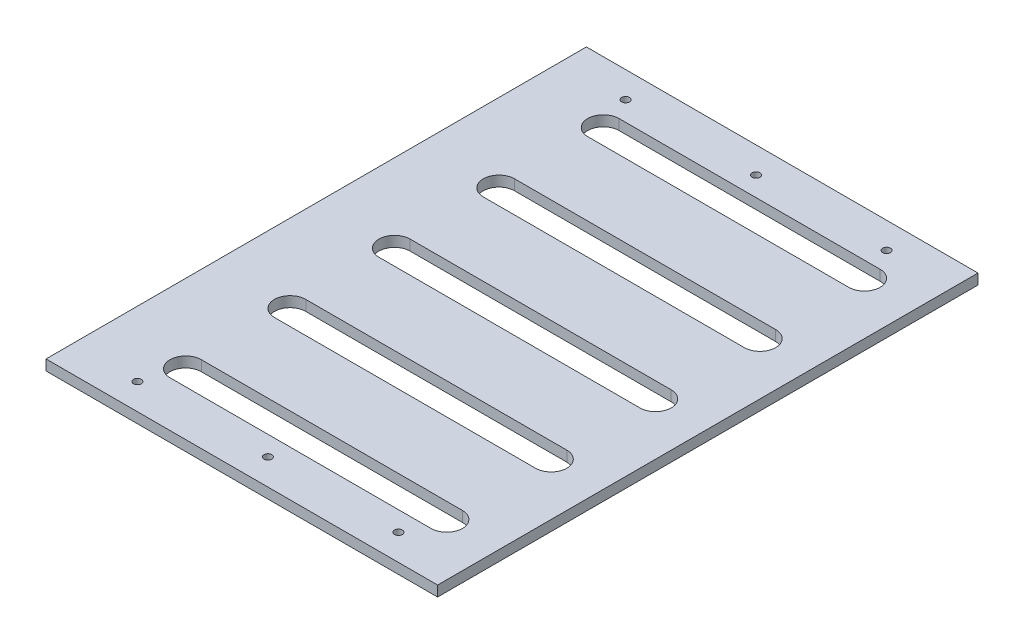
ISO-10303-21;
HEADER;
FILE_DESCRIPTION(('STEP AP214'),'2;1');
FILE_NAME('part.step','',(''),(''),'','','');
FILE_SCHEMA(('AUTOMOTIVE_DESIGN { 1 0 10303 214 1 1 1 1 }'));
ENDSEC;
DATA;
#1=APPLICATION_CONTEXT('core data for automotive mechanical design processes');
#2=APPLICATION_PROTOCOL_DEFINITION('international standard','automotive_design',2000,#1);
#3=PRODUCT_CONTEXT('',#1,'mechanical');
#4=PRODUCT('Part','Part','',(#3));
#5=PRODUCT_RELATED_PRODUCT_CATEGORY('part','',(#4));
#6=PRODUCT_DEFINITION_FORMATION('','',#4);
#7=PRODUCT_DEFINITION_CONTEXT('part definition',#1,'design');
#8=PRODUCT_DEFINITION('design','',#6,#7);
#9=PRODUCT_DEFINITION_SHAPE('','',#8);
#10=(LENGTH_UNIT() NAMED_UNIT(*) SI_UNIT(.MILLI.,.METRE.));
#11=(NAMED_UNIT(*) PLANE_ANGLE_UNIT() SI_UNIT($,.RADIAN.));
#12=(NAMED_UNIT(*) SI_UNIT($,.STERADIAN.) SOLID_ANGLE_UNIT());
#13=UNCERTAINTY_MEASURE_WITH_UNIT(LENGTH_MEASURE(1.E-05),#10,'distance_accuracy_value','');
#14=(GEOMETRIC_REPRESENTATION_CONTEXT(3) GLOBAL_UNCERTAINTY_ASSIGNED_CONTEXT((#13)) GLOBAL_UNIT_ASSIGNED_CONTEXT((#10,
#11,#12)) REPRESENTATION_CONTEXT('',''));
#15=CARTESIAN_POINT('',(0.,0.,0.));
#16=DIRECTION('',(0.,0.,1.));
#17=DIRECTION('',(1.,0.,0.));
#18=AXIS2_PLACEMENT_3D('',#15,#16,#17);
#19=CARTESIAN_POINT('',(0.,4.,0.));
#20=DIRECTION('',(1.,0.,0.));
#21=DIRECTION('',(0.,0.,-1.));
#22=AXIS2_PLACEMENT_3D('',#19,#20,#21);
#23=PLANE('',#22);
#24=DIRECTION('',(0.,0.,1.));
#25=VECTOR('',#24,1.);
#26=CARTESIAN_POINT('',(0.,0.,0.));
#27=LINE('',#26,#25);
#28=CARTESIAN_POINT('',(0.,0.,-207.));
#29=VERTEX_POINT('',#28);
#30=CARTESIAN_POINT('',(0.,0.,0.));
#31=VERTEX_POINT('',#30);
#32=EDGE_CURVE('E356',#29,#31,#27,.T.);
#33=ORIENTED_EDGE('',*,*,#32,.T.);
#34=DIRECTION('',(0.,-1.,0.));
#35=VECTOR('',#34,1.);
#36=CARTESIAN_POINT('',(0.,4.,0.));
#37=LINE('',#36,#35);
#38=CARTESIAN_POINT('',(0.,4.,0.));
#39=VERTEX_POINT('',#38);
#40=EDGE_CURVE('E11',#39,#31,#37,.T.);
#41=ORIENTED_EDGE('',*,*,#40,.F.);
#42=DIRECTION('',(0.,0.,1.));
#43=VECTOR('',#42,1.);
#44=CARTESIAN_POINT('',(0.,4.,0.));
#45=LINE('',#44,#43);
#46=CARTESIAN_POINT('',(0.,4.,-207.));
#47=VERTEX_POINT('',#46);
#48=EDGE_CURVE('E363',#47,#39,#45,.T.);
#49=ORIENTED_EDGE('',*,*,#48,.F.);
#50=DIRECTION('',(0.,-1.,0.));
#51=VECTOR('',#50,1.);
#52=CARTESIAN_POINT('',(0.,4.,-207.));
#53=LINE('',#52,#51);
#54=EDGE_CURVE('E373',#47,#29,#53,.T.);
#55=ORIENTED_EDGE('',*,*,#54,.T.);
#56=EDGE_LOOP('',(#33,#41,#49,#55));
#57=FACE_BOUND('',#56,.T.);
#58=ADVANCED_FACE('F33',(#57),#23,.F.);
#59=CARTESIAN_POINT('',(0.,4.,0.));
#60=DIRECTION('',(0.,0.,-1.));
#61=DIRECTION('',(-1.,0.,0.));
#62=AXIS2_PLACEMENT_3D('',#59,#60,#61);
#63=PLANE('',#62);
#64=DIRECTION('',(1.,0.,0.));
#65=VECTOR('',#64,1.);
#66=CARTESIAN_POINT('',(0.,0.,0.));
#67=LINE('',#66,#65);
#68=CARTESIAN_POINT('',(150.,0.,0.));
#69=VERTEX_POINT('',#68);
#70=EDGE_CURVE('E376',#31,#69,#67,.T.);
#71=ORIENTED_EDGE('',*,*,#70,.T.);
#72=DIRECTION('',(0.,-1.,0.));
#73=VECTOR('',#72,1.);
#74=CARTESIAN_POINT('',(150.,4.,0.));
#75=LINE('',#74,#73);
#76=CARTESIAN_POINT('',(150.,4.,0.));
#77=VERTEX_POINT('',#76);
#78=EDGE_CURVE('E40',#77,#69,#75,.T.);
#79=ORIENTED_EDGE('',*,*,#78,.F.);
#80=DIRECTION('',(1.,0.,0.));
#81=VECTOR('',#80,1.);
#82=CARTESIAN_POINT('',(0.,4.,0.));
#83=LINE('',#82,#81);
#84=EDGE_CURVE('E366',#39,#77,#83,.T.);
#85=ORIENTED_EDGE('',*,*,#84,.F.);
#86=ORIENTED_EDGE('',*,*,#40,.T.);
#87=EDGE_LOOP('',(#71,#79,#85,#86));
#88=FACE_BOUND('',#87,.T.);
#89=ADVANCED_FACE('F405',(#88),#63,.F.);
#90=CARTESIAN_POINT('',(150.,4.,0.));
#91=DIRECTION('',(-1.,0.,0.));
#92=DIRECTION('',(0.,0.,1.));
#93=AXIS2_PLACEMENT_3D('',#90,#91,#92);
#94=PLANE('',#93);
#95=DIRECTION('',(0.,0.,-1.));
#96=VECTOR('',#95,1.);
#97=CARTESIAN_POINT('',(150.,0.,0.));
#98=LINE('',#97,#96);
#99=CARTESIAN_POINT('',(150.,0.,-207.));
#100=VERTEX_POINT('',#99);
#101=EDGE_CURVE('E378',#69,#100,#98,.T.);
#102=ORIENTED_EDGE('',*,*,#101,.T.);
#103=DIRECTION('',(0.,-1.,0.));
#104=VECTOR('',#103,1.);
#105=CARTESIAN_POINT('',(150.,4.,-207.));
#106=LINE('',#105,#104);
#107=CARTESIAN_POINT('',(150.,4.,-207.));
#108=VERTEX_POINT('',#107);
#109=EDGE_CURVE('E383',#108,#100,#106,.T.);
#110=ORIENTED_EDGE('',*,*,#109,.F.);
#111=DIRECTION('',(0.,0.,-1.));
#112=VECTOR('',#111,1.);
#113=CARTESIAN_POINT('',(150.,4.,0.));
#114=LINE('',#113,#112);
#115=EDGE_CURVE('E369',#77,#108,#114,.T.);
#116=ORIENTED_EDGE('',*,*,#115,.F.);
#117=ORIENTED_EDGE('',*,*,#78,.T.);
#118=EDGE_LOOP('',(#102,#110,#116,#117));
#119=FACE_BOUND('',#118,.T.);
#120=ADVANCED_FACE('F390',(#119),#94,.F.);
#121=CARTESIAN_POINT('',(0.,4.,-207.));
#122=DIRECTION('',(0.,0.,1.));
#123=DIRECTION('',(1.,0.,0.));
#124=AXIS2_PLACEMENT_3D('',#121,#122,#123);
#125=PLANE('',#124);
#126=DIRECTION('',(-1.,0.,0.));
#127=VECTOR('',#126,1.);
#128=CARTESIAN_POINT('',(0.,0.,-207.));
#129=LINE('',#128,#127);
#130=EDGE_CURVE('E367',#100,#29,#129,.T.);
#131=ORIENTED_EDGE('',*,*,#130,.T.);
#132=ORIENTED_EDGE('',*,*,#54,.F.);
#133=DIRECTION('',(-1.,0.,0.));
#134=VECTOR('',#133,1.);
#135=CARTESIAN_POINT('',(0.,4.,-207.));
#136=LINE('',#135,#134);
#137=EDGE_CURVE('E371',#108,#47,#136,.T.);
#138=ORIENTED_EDGE('',*,*,#137,.F.);
#139=ORIENTED_EDGE('',*,*,#109,.T.);
#140=EDGE_LOOP('',(#131,#132,#138,#139));
#141=FACE_BOUND('',#140,.T.);
#142=ADVANCED_FACE('F398',(#141),#125,.F.);
#143=CARTESIAN_POINT('',(0.,4.,0.));
#144=DIRECTION('',(0.,-1.,0.));
#145=DIRECTION('',(0.,0.,-1.));
#146=AXIS2_PLACEMENT_3D('',#143,#144,#145);
#147=PLANE('',#146);
#148=CARTESIAN_POINT('',(75.,4.,-197.));
#149=DIRECTION('',(0.,1.,0.));
#150=DIRECTION('',(0.,0.,1.));
#151=AXIS2_PLACEMENT_3D('',#148,#149,#150);
#152=CIRCLE('',#151,1.50000000000001);
#153=CARTESIAN_POINT('',(75.,4.,-195.5));
#154=VERTEX_POINT('',#153);
#155=EDGE_CURVE('E527',#154,#154,#152,.T.);
#156=ORIENTED_EDGE('',*,*,#155,.F.);
#157=EDGE_LOOP('',(#156));
#158=FACE_BOUND('',#157,.T.);
#159=CARTESIAN_POINT('',(25.,4.,-197.));
#160=DIRECTION('',(0.,1.,0.));
#161=DIRECTION('',(0.,0.,1.));
#162=AXIS2_PLACEMENT_3D('',#159,#160,#161);
#163=CIRCLE('',#162,1.5);
#164=CARTESIAN_POINT('',(25.,4.,-195.5));
#165=VERTEX_POINT('',#164);
#166=EDGE_CURVE('E532',#165,#165,#163,.T.);
#167=ORIENTED_EDGE('',*,*,#166,.F.);
#168=EDGE_LOOP('',(#167));
#169=FACE_BOUND('',#168,.T.);
#170=CARTESIAN_POINT('',(25.,4.,-10.));
#171=DIRECTION('',(0.,1.,0.));
#172=DIRECTION('',(0.,0.,-1.));
#173=AXIS2_PLACEMENT_3D('',#170,#171,#172);
#174=CIRCLE('',#173,1.5);
#175=CARTESIAN_POINT('',(25.,4.,-11.5));
#176=VERTEX_POINT('',#175);
#177=EDGE_CURVE('E540',#176,#176,#174,.T.);
#178=ORIENTED_EDGE('',*,*,#177,.F.);
#179=EDGE_LOOP('',(#178));
#180=FACE_BOUND('',#179,.T.);
#181=CARTESIAN_POINT('',(75.,4.,-9.99999999999995));
#182=DIRECTION('',(0.,1.,0.));
#183=DIRECTION('',(0.,0.,-1.));
#184=AXIS2_PLACEMENT_3D('',#181,#182,#183);
#185=CIRCLE('',#184,1.50000000000001);
#186=CARTESIAN_POINT('',(75.,4.,-11.5));
#187=VERTEX_POINT('',#186);
#188=EDGE_CURVE('E546',#187,#187,#185,.T.);
#189=ORIENTED_EDGE('',*,*,#188,.F.);
#190=EDGE_LOOP('',(#189));
#191=FACE_BOUND('',#190,.T.);
#192=CARTESIAN_POINT('',(125.,4.,-10.));
#193=DIRECTION('',(0.,1.,0.));
#194=DIRECTION('',(0.,0.,-1.));
#195=AXIS2_PLACEMENT_3D('',#192,#193,#194);
#196=CIRCLE('',#195,1.5);
#197=CARTESIAN_POINT('',(125.,4.,-11.5));
#198=VERTEX_POINT('',#197);
#199=EDGE_CURVE('E552',#198,#198,#196,.T.);
#200=ORIENTED_EDGE('',*,*,#199,.F.);
#201=EDGE_LOOP('',(#200));
#202=FACE_BOUND('',#201,.T.);
#203=CARTESIAN_POINT('',(125.,4.,-197.));
#204=DIRECTION('',(0.,1.,0.));
#205=DIRECTION('',(0.,0.,1.));
#206=AXIS2_PLACEMENT_3D('',#203,#204,#205);
#207=CIRCLE('',#206,1.5);
#208=CARTESIAN_POINT('',(125.,4.,-195.5));
#209=VERTEX_POINT('',#208);
#210=EDGE_CURVE('E220',#209,#209,#207,.T.);
#211=ORIENTED_EDGE('',*,*,#210,.F.);
#212=EDGE_LOOP('',(#211));
#213=FACE_BOUND('',#212,.T.);
#214=DIRECTION('',(1.,0.,0.));
#215=VECTOR('',#214,1.);
#216=CARTESIAN_POINT('',(30.,4.,-137.5));
#217=LINE('',#216,#215);
#218=CARTESIAN_POINT('',(30.,4.,-137.5));
#219=VERTEX_POINT('',#218);
#220=CARTESIAN_POINT('',(130.,4.,-137.5));
#221=VERTEX_POINT('',#220);
#222=EDGE_CURVE('E226',#219,#221,#217,.T.);
#223=ORIENTED_EDGE('',*,*,#222,.F.);
#224=CARTESIAN_POINT('',(30.,4.,-143.5));
#225=DIRECTION('',(0.,1.,0.));
#226=DIRECTION('',(0.,0.,1.));
#227=AXIS2_PLACEMENT_3D('',#224,#225,#226);
#228=CIRCLE('',#227,6.00000000000001);
#229=CARTESIAN_POINT('',(30.,4.,-149.5));
#230=VERTEX_POINT('',#229);
#231=EDGE_CURVE('E47',#230,#219,#228,.T.);
#232=ORIENTED_EDGE('',*,*,#231,.F.);
#233=DIRECTION('',(-1.,0.,0.));
#234=VECTOR('',#233,1.);
#235=CARTESIAN_POINT('',(30.,4.,-149.5));
#236=LINE('',#235,#234);
#237=CARTESIAN_POINT('',(130.,4.,-149.5));
#238=VERTEX_POINT('',#237);
#239=EDGE_CURVE('E214',#238,#230,#236,.T.);
#240=ORIENTED_EDGE('',*,*,#239,.F.);
#241=CARTESIAN_POINT('',(130.,4.,-143.5));
#242=DIRECTION('',(0.,1.,0.));
#243=DIRECTION('',(0.,0.,1.));
#244=AXIS2_PLACEMENT_3D('',#241,#242,#243);
#245=CIRCLE('',#244,6.00000000000001);
#246=EDGE_CURVE('E217',#221,#238,#245,.T.);
#247=ORIENTED_EDGE('',*,*,#246,.F.);
#248=EDGE_LOOP('',(#223,#232,#240,#247));
#249=FACE_BOUND('',#248,.T.);
#250=DIRECTION('',(1.,0.,0.));
#251=VECTOR('',#250,1.);
#252=CARTESIAN_POINT('',(30.,4.,-97.5));
#253=LINE('',#252,#251);
#254=CARTESIAN_POINT('',(30.,4.,-97.5));
#255=VERTEX_POINT('',#254);
#256=CARTESIAN_POINT('',(130.,4.,-97.5));
#257=VERTEX_POINT('',#256);
#258=EDGE_CURVE('E252',#255,#257,#253,.T.);
#259=ORIENTED_EDGE('',*,*,#258,.F.);
#260=CARTESIAN_POINT('',(30.,4.,-103.5));
#261=DIRECTION('',(0.,1.,0.));
#262=DIRECTION('',(0.,0.,-1.));
#263=AXIS2_PLACEMENT_3D('',#260,#261,#262);
#264=CIRCLE('',#263,6.00000000000001);
#265=CARTESIAN_POINT('',(30.,4.,-109.5));
#266=VERTEX_POINT('',#265);
#267=EDGE_CURVE('E55',#266,#255,#264,.T.);
#268=ORIENTED_EDGE('',*,*,#267,.F.);
#269=DIRECTION('',(-1.,0.,0.));
#270=VECTOR('',#269,1.);
#271=CARTESIAN_POINT('',(30.,4.,-109.5));
#272=LINE('',#271,#270);
#273=CARTESIAN_POINT('',(130.,4.,-109.5));
#274=VERTEX_POINT('',#273);
#275=EDGE_CURVE('E241',#274,#266,#272,.T.);
#276=ORIENTED_EDGE('',*,*,#275,.F.);
#277=CARTESIAN_POINT('',(130.,4.,-103.5));
#278=DIRECTION('',(0.,1.,0.));
#279=DIRECTION('',(0.,0.,-1.));
#280=AXIS2_PLACEMENT_3D('',#277,#278,#279);
#281=CIRCLE('',#280,6.00000000000001);
#282=EDGE_CURVE('E256',#257,#274,#281,.T.);
#283=ORIENTED_EDGE('',*,*,#282,.F.);
#284=EDGE_LOOP('',(#259,#268,#276,#283));
#285=FACE_BOUND('',#284,.T.);
#286=DIRECTION('',(1.,0.,0.));
#287=VECTOR('',#286,1.);
#288=CARTESIAN_POINT('',(30.,4.,-57.5));
#289=LINE('',#288,#287);
#290=CARTESIAN_POINT('',(30.,4.,-57.5));
#291=VERTEX_POINT('',#290);
#292=CARTESIAN_POINT('',(130.,4.,-57.5));
#293=VERTEX_POINT('',#292);
#294=EDGE_CURVE('E283',#291,#293,#289,.T.);
#295=ORIENTED_EDGE('',*,*,#294,.F.);
#296=CARTESIAN_POINT('',(30.,4.,-63.5));
#297=DIRECTION('',(0.,1.,0.));
#298=DIRECTION('',(0.,0.,-1.));
#299=AXIS2_PLACEMENT_3D('',#296,#297,#298);
#300=CIRCLE('',#299,6.00000000000001);
#301=CARTESIAN_POINT('',(30.,4.,-69.5));
#302=VERTEX_POINT('',#301);
#303=EDGE_CURVE('E281',#302,#291,#300,.T.);
#304=ORIENTED_EDGE('',*,*,#303,.F.);
#305=DIRECTION('',(-1.,0.,0.));
#306=VECTOR('',#305,1.);
#307=CARTESIAN_POINT('',(30.,4.,-69.5));
#308=LINE('',#307,#306);
#309=CARTESIAN_POINT('',(130.,4.,-69.5000000000001));
#310=VERTEX_POINT('',#309);
#311=EDGE_CURVE('E271',#310,#302,#308,.T.);
#312=ORIENTED_EDGE('',*,*,#311,.F.);
#313=CARTESIAN_POINT('',(130.,4.,-63.5000000000001));
#314=DIRECTION('',(0.,1.,0.));
#315=DIRECTION('',(0.,0.,-1.));
#316=AXIS2_PLACEMENT_3D('',#313,#314,#315);
#317=CIRCLE('',#316,6.00000000000001);
#318=EDGE_CURVE('E287',#293,#310,#317,.T.);
#319=ORIENTED_EDGE('',*,*,#318,.F.);
#320=EDGE_LOOP('',(#295,#304,#312,#319));
#321=FACE_BOUND('',#320,.T.);
#322=DIRECTION('',(1.,0.,0.));
#323=VECTOR('',#322,1.);
#324=CARTESIAN_POINT('',(30.,4.,-17.5));
#325=LINE('',#324,#323);
#326=CARTESIAN_POINT('',(30.,4.,-17.5));
#327=VERTEX_POINT('',#326);
#328=CARTESIAN_POINT('',(130.,4.,-17.5));
#329=VERTEX_POINT('',#328);
#330=EDGE_CURVE('E315',#327,#329,#325,.T.);
#331=ORIENTED_EDGE('',*,*,#330,.F.);
#332=CARTESIAN_POINT('',(30.,4.,-23.5));
#333=DIRECTION('',(0.,1.,0.));
#334=DIRECTION('',(0.,0.,-1.));
#335=AXIS2_PLACEMENT_3D('',#332,#333,#334);
#336=CIRCLE('',#335,5.99999999999998);
#337=CARTESIAN_POINT('',(30.,4.,-29.5));
#338=VERTEX_POINT('',#337);
#339=EDGE_CURVE('E313',#338,#327,#336,.T.);
#340=ORIENTED_EDGE('',*,*,#339,.F.);
#341=DIRECTION('',(-1.,0.,0.));
#342=VECTOR('',#341,1.);
#343=CARTESIAN_POINT('',(30.,4.,-29.5));
#344=LINE('',#343,#342);
#345=CARTESIAN_POINT('',(130.,4.,-29.5));
#346=VERTEX_POINT('',#345);
#347=EDGE_CURVE('E303',#346,#338,#344,.T.);
#348=ORIENTED_EDGE('',*,*,#347,.F.);
#349=CARTESIAN_POINT('',(130.,4.,-23.5));
#350=DIRECTION('',(0.,1.,0.));
#351=DIRECTION('',(0.,0.,-1.));
#352=AXIS2_PLACEMENT_3D('',#349,#350,#351);
#353=CIRCLE('',#352,6.);
#354=EDGE_CURVE('E319',#329,#346,#353,.T.);
#355=ORIENTED_EDGE('',*,*,#354,.F.);
#356=EDGE_LOOP('',(#331,#340,#348,#355));
#357=FACE_BOUND('',#356,.T.);
#358=DIRECTION('',(1.,0.,0.));
#359=VECTOR('',#358,1.);
#360=CARTESIAN_POINT('',(30.,4.,-177.5));
#361=LINE('',#360,#359);
#362=CARTESIAN_POINT('',(30.,4.,-177.5));
#363=VERTEX_POINT('',#362);
#364=CARTESIAN_POINT('',(130.,4.,-177.5));
#365=VERTEX_POINT('',#364);
#366=EDGE_CURVE('E346',#363,#365,#361,.T.);
#367=ORIENTED_EDGE('',*,*,#366,.F.);
#368=CARTESIAN_POINT('',(30.,4.,-183.5));
#369=DIRECTION('',(0.,1.,0.));
#370=DIRECTION('',(0.,0.,1.));
#371=AXIS2_PLACEMENT_3D('',#368,#369,#370);
#372=CIRCLE('',#371,5.99999999999998);
#373=CARTESIAN_POINT('',(30.,4.,-189.5));
#374=VERTEX_POINT('',#373);
#375=EDGE_CURVE('E233',#374,#363,#372,.T.);
#376=ORIENTED_EDGE('',*,*,#375,.F.);
#377=DIRECTION('',(-1.,0.,0.));
#378=VECTOR('',#377,1.);
#379=CARTESIAN_POINT('',(30.,4.,-189.5));
#380=LINE('',#379,#378);
#381=CARTESIAN_POINT('',(130.,4.,-189.5));
#382=VERTEX_POINT('',#381);
#383=EDGE_CURVE('E335',#382,#374,#380,.T.);
#384=ORIENTED_EDGE('',*,*,#383,.F.);
#385=CARTESIAN_POINT('',(130.,4.,-183.5));
#386=DIRECTION('',(0.,1.,0.));
#387=DIRECTION('',(0.,0.,1.));
#388=AXIS2_PLACEMENT_3D('',#385,#386,#387);
#389=CIRCLE('',#388,5.99999999999999);
#390=EDGE_CURVE('E349',#365,#382,#389,.T.);
#391=ORIENTED_EDGE('',*,*,#390,.F.);
#392=EDGE_LOOP('',(#367,#376,#384,#391));
#393=FACE_BOUND('',#392,.T.);
#394=ORIENTED_EDGE('',*,*,#48,.T.);
#395=ORIENTED_EDGE('',*,*,#84,.T.);
#396=ORIENTED_EDGE('',*,*,#115,.T.);
#397=ORIENTED_EDGE('',*,*,#137,.T.);
#398=EDGE_LOOP('',(#394,#395,#396,#397));
#399=FACE_BOUND('',#398,.T.);
#400=ADVANCED_FACE('F404',(#158,#169,#180,#191,#202,#213,#249,#285,#321,#357,#393,#399),#147,.F.);
#401=CARTESIAN_POINT('',(0.,0.,0.));
#402=DIRECTION('',(0.,-1.,0.));
#403=DIRECTION('',(0.,0.,-1.));
#404=AXIS2_PLACEMENT_3D('',#401,#402,#403);
#405=PLANE('',#404);
#406=CARTESIAN_POINT('',(75.,0.,-197.));
#407=DIRECTION('',(0.,1.,0.));
#408=DIRECTION('',(0.,0.,1.));
#409=AXIS2_PLACEMENT_3D('',#406,#407,#408);
#410=CIRCLE('',#409,1.50000000000001);
#411=CARTESIAN_POINT('',(75.,0.,-195.5));
#412=VERTEX_POINT('',#411);
#413=EDGE_CURVE('E524',#412,#412,#410,.T.);
#414=ORIENTED_EDGE('',*,*,#413,.T.);
#415=EDGE_LOOP('',(#414));
#416=FACE_BOUND('',#415,.T.);
#417=CARTESIAN_POINT('',(25.,0.,-197.));
#418=DIRECTION('',(0.,1.,0.));
#419=DIRECTION('',(0.,0.,1.));
#420=AXIS2_PLACEMENT_3D('',#417,#418,#419);
#421=CIRCLE('',#420,1.5);
#422=CARTESIAN_POINT('',(25.,0.,-195.5));
#423=VERTEX_POINT('',#422);
#424=EDGE_CURVE('E528',#423,#423,#421,.T.);
#425=ORIENTED_EDGE('',*,*,#424,.T.);
#426=EDGE_LOOP('',(#425));
#427=FACE_BOUND('',#426,.T.);
#428=CARTESIAN_POINT('',(25.,0.,-10.));
#429=DIRECTION('',(0.,1.,0.));
#430=DIRECTION('',(0.,0.,-1.));
#431=AXIS2_PLACEMENT_3D('',#428,#429,#430);
#432=CIRCLE('',#431,1.5);
#433=CARTESIAN_POINT('',(25.,0.,-11.5));
#434=VERTEX_POINT('',#433);
#435=EDGE_CURVE('E537',#434,#434,#432,.T.);
#436=ORIENTED_EDGE('',*,*,#435,.T.);
#437=EDGE_LOOP('',(#436));
#438=FACE_BOUND('',#437,.T.);
#439=CARTESIAN_POINT('',(75.,0.,-9.99999999999995));
#440=DIRECTION('',(0.,1.,0.));
#441=DIRECTION('',(0.,0.,-1.));
#442=AXIS2_PLACEMENT_3D('',#439,#440,#441);
#443=CIRCLE('',#442,1.50000000000001);
#444=CARTESIAN_POINT('',(75.,0.,-11.5));
#445=VERTEX_POINT('',#444);
#446=EDGE_CURVE('E543',#445,#445,#443,.T.);
#447=ORIENTED_EDGE('',*,*,#446,.T.);
#448=EDGE_LOOP('',(#447));
#449=FACE_BOUND('',#448,.T.);
#450=CARTESIAN_POINT('',(125.,0.,-10.));
#451=DIRECTION('',(0.,1.,0.));
#452=DIRECTION('',(0.,0.,-1.));
#453=AXIS2_PLACEMENT_3D('',#450,#451,#452);
#454=CIRCLE('',#453,1.5);
#455=CARTESIAN_POINT('',(125.,0.,-11.5));
#456=VERTEX_POINT('',#455);
#457=EDGE_CURVE('E549',#456,#456,#454,.T.);
#458=ORIENTED_EDGE('',*,*,#457,.T.);
#459=EDGE_LOOP('',(#458));
#460=FACE_BOUND('',#459,.T.);
#461=CARTESIAN_POINT('',(125.,0.,-197.));
#462=DIRECTION('',(0.,1.,0.));
#463=DIRECTION('',(0.,0.,1.));
#464=AXIS2_PLACEMENT_3D('',#461,#462,#463);
#465=CIRCLE('',#464,1.5);
#466=CARTESIAN_POINT('',(125.,0.,-195.5));
#467=VERTEX_POINT('',#466);
#468=EDGE_CURVE('E316',#467,#467,#465,.T.);
#469=ORIENTED_EDGE('',*,*,#468,.T.);
#470=EDGE_LOOP('',(#469));
#471=FACE_BOUND('',#470,.T.);
#472=CARTESIAN_POINT('',(30.,0.,-143.5));
#473=DIRECTION('',(0.,1.,0.));
#474=DIRECTION('',(0.,0.,1.));
#475=AXIS2_PLACEMENT_3D('',#472,#473,#474);
#476=CIRCLE('',#475,6.00000000000001);
#477=CARTESIAN_POINT('',(30.,0.,-149.5));
#478=VERTEX_POINT('',#477);
#479=CARTESIAN_POINT('',(30.,0.,-137.5));
#480=VERTEX_POINT('',#479);
#481=EDGE_CURVE('E195',#478,#480,#476,.T.);
#482=ORIENTED_EDGE('',*,*,#481,.T.);
#483=DIRECTION('',(1.,0.,0.));
#484=VECTOR('',#483,1.);
#485=CARTESIAN_POINT('',(30.,0.,-137.5));
#486=LINE('',#485,#484);
#487=CARTESIAN_POINT('',(130.,0.,-137.5));
#488=VERTEX_POINT('',#487);
#489=EDGE_CURVE('E205',#480,#488,#486,.T.);
#490=ORIENTED_EDGE('',*,*,#489,.T.);
#491=CARTESIAN_POINT('',(130.,0.,-143.5));
#492=DIRECTION('',(0.,1.,0.));
#493=DIRECTION('',(0.,0.,1.));
#494=AXIS2_PLACEMENT_3D('',#491,#492,#493);
#495=CIRCLE('',#494,6.00000000000001);
#496=CARTESIAN_POINT('',(130.,0.,-149.5));
#497=VERTEX_POINT('',#496);
#498=EDGE_CURVE('E209',#488,#497,#495,.T.);
#499=ORIENTED_EDGE('',*,*,#498,.T.);
#500=DIRECTION('',(-1.,0.,0.));
#501=VECTOR('',#500,1.);
#502=CARTESIAN_POINT('',(30.,0.,-149.5));
#503=LINE('',#502,#501);
#504=EDGE_CURVE('E201',#497,#478,#503,.T.);
#505=ORIENTED_EDGE('',*,*,#504,.T.);
#506=EDGE_LOOP('',(#482,#490,#499,#505));
#507=FACE_BOUND('',#506,.T.);
#508=CARTESIAN_POINT('',(30.,0.,-103.5));
#509=DIRECTION('',(0.,1.,0.));
#510=DIRECTION('',(0.,0.,-1.));
#511=AXIS2_PLACEMENT_3D('',#508,#509,#510);
#512=CIRCLE('',#511,6.00000000000001);
#513=CARTESIAN_POINT('',(30.,0.,-109.5));
#514=VERTEX_POINT('',#513);
#515=CARTESIAN_POINT('',(30.,0.,-97.5));
#516=VERTEX_POINT('',#515);
#517=EDGE_CURVE('E237',#514,#516,#512,.T.);
#518=ORIENTED_EDGE('',*,*,#517,.T.);
#519=DIRECTION('',(1.,0.,0.));
#520=VECTOR('',#519,1.);
#521=CARTESIAN_POINT('',(30.,0.,-97.5));
#522=LINE('',#521,#520);
#523=CARTESIAN_POINT('',(130.,0.,-97.5));
#524=VERTEX_POINT('',#523);
#525=EDGE_CURVE('E240',#516,#524,#522,.T.);
#526=ORIENTED_EDGE('',*,*,#525,.T.);
#527=CARTESIAN_POINT('',(130.,0.,-103.5));
#528=DIRECTION('',(0.,1.,0.));
#529=DIRECTION('',(0.,0.,-1.));
#530=AXIS2_PLACEMENT_3D('',#527,#528,#529);
#531=CIRCLE('',#530,6.00000000000001);
#532=CARTESIAN_POINT('',(130.,0.,-109.5));
#533=VERTEX_POINT('',#532);
#534=EDGE_CURVE('E244',#524,#533,#531,.T.);
#535=ORIENTED_EDGE('',*,*,#534,.T.);
#536=DIRECTION('',(-1.,0.,0.));
#537=VECTOR('',#536,1.);
#538=CARTESIAN_POINT('',(30.,0.,-109.5));
#539=LINE('',#538,#537);
#540=EDGE_CURVE('E247',#533,#514,#539,.T.);
#541=ORIENTED_EDGE('',*,*,#540,.T.);
#542=EDGE_LOOP('',(#518,#526,#535,#541));
#543=FACE_BOUND('',#542,.T.);
#544=CARTESIAN_POINT('',(30.,0.,-63.5));
#545=DIRECTION('',(0.,1.,0.));
#546=DIRECTION('',(0.,0.,-1.));
#547=AXIS2_PLACEMENT_3D('',#544,#545,#546);
#548=CIRCLE('',#547,6.00000000000001);
#549=CARTESIAN_POINT('',(30.,0.,-69.5));
#550=VERTEX_POINT('',#549);
#551=CARTESIAN_POINT('',(30.,0.,-57.5));
#552=VERTEX_POINT('',#551);
#553=EDGE_CURVE('E267',#550,#552,#548,.T.);
#554=ORIENTED_EDGE('',*,*,#553,.T.);
#555=DIRECTION('',(1.,0.,0.));
#556=VECTOR('',#555,1.);
#557=CARTESIAN_POINT('',(30.,0.,-57.5));
#558=LINE('',#557,#556);
#559=CARTESIAN_POINT('',(130.,0.,-57.5));
#560=VERTEX_POINT('',#559);
#561=EDGE_CURVE('E270',#552,#560,#558,.T.);
#562=ORIENTED_EDGE('',*,*,#561,.T.);
#563=CARTESIAN_POINT('',(130.,0.,-63.5000000000001));
#564=DIRECTION('',(0.,1.,0.));
#565=DIRECTION('',(0.,0.,-1.));
#566=AXIS2_PLACEMENT_3D('',#563,#564,#565);
#567=CIRCLE('',#566,6.00000000000001);
#568=CARTESIAN_POINT('',(130.,0.,-69.5000000000001));
#569=VERTEX_POINT('',#568);
#570=EDGE_CURVE('E274',#560,#569,#567,.T.);
#571=ORIENTED_EDGE('',*,*,#570,.T.);
#572=DIRECTION('',(-1.,0.,0.));
#573=VECTOR('',#572,1.);
#574=CARTESIAN_POINT('',(30.,0.,-69.5));
#575=LINE('',#574,#573);
#576=EDGE_CURVE('E277',#569,#550,#575,.T.);
#577=ORIENTED_EDGE('',*,*,#576,.T.);
#578=EDGE_LOOP('',(#554,#562,#571,#577));
#579=FACE_BOUND('',#578,.T.);
#580=CARTESIAN_POINT('',(30.,0.,-23.5));
#581=DIRECTION('',(0.,1.,0.));
#582=DIRECTION('',(0.,0.,-1.));
#583=AXIS2_PLACEMENT_3D('',#580,#581,#582);
#584=CIRCLE('',#583,5.99999999999998);
#585=CARTESIAN_POINT('',(30.,0.,-29.5));
#586=VERTEX_POINT('',#585);
#587=CARTESIAN_POINT('',(30.,0.,-17.5));
#588=VERTEX_POINT('',#587);
#589=EDGE_CURVE('E299',#586,#588,#584,.T.);
#590=ORIENTED_EDGE('',*,*,#589,.T.);
#591=DIRECTION('',(1.,0.,0.));
#592=VECTOR('',#591,1.);
#593=CARTESIAN_POINT('',(30.,0.,-17.5));
#594=LINE('',#593,#592);
#595=CARTESIAN_POINT('',(130.,0.,-17.5));
#596=VERTEX_POINT('',#595);
#597=EDGE_CURVE('E302',#588,#596,#594,.T.);
#598=ORIENTED_EDGE('',*,*,#597,.T.);
#599=CARTESIAN_POINT('',(130.,0.,-23.5));
#600=DIRECTION('',(0.,1.,0.));
#601=DIRECTION('',(0.,0.,-1.));
#602=AXIS2_PLACEMENT_3D('',#599,#600,#601);
#603=CIRCLE('',#602,6.);
#604=CARTESIAN_POINT('',(130.,0.,-29.5));
#605=VERTEX_POINT('',#604);
#606=EDGE_CURVE('E306',#596,#605,#603,.T.);
#607=ORIENTED_EDGE('',*,*,#606,.T.);
#608=DIRECTION('',(-1.,0.,0.));
#609=VECTOR('',#608,1.);
#610=CARTESIAN_POINT('',(30.,0.,-29.5));
#611=LINE('',#610,#609);
#612=EDGE_CURVE('E309',#605,#586,#611,.T.);
#613=ORIENTED_EDGE('',*,*,#612,.T.);
#614=EDGE_LOOP('',(#590,#598,#607,#613));
#615=FACE_BOUND('',#614,.T.);
#616=CARTESIAN_POINT('',(30.,0.,-183.5));
#617=DIRECTION('',(0.,1.,0.));
#618=DIRECTION('',(0.,0.,1.));
#619=AXIS2_PLACEMENT_3D('',#616,#617,#618);
#620=CIRCLE('',#619,5.99999999999998);
#621=CARTESIAN_POINT('',(30.,0.,-189.5));
#622=VERTEX_POINT('',#621);
#623=CARTESIAN_POINT('',(30.,0.,-177.5));
#624=VERTEX_POINT('',#623);
#625=EDGE_CURVE('E331',#622,#624,#620,.T.);
#626=ORIENTED_EDGE('',*,*,#625,.T.);
#627=DIRECTION('',(1.,0.,0.));
#628=VECTOR('',#627,1.);
#629=CARTESIAN_POINT('',(30.,0.,-177.5));
#630=LINE('',#629,#628);
#631=CARTESIAN_POINT('',(130.,0.,-177.5));
#632=VERTEX_POINT('',#631);
#633=EDGE_CURVE('E334',#624,#632,#630,.T.);
#634=ORIENTED_EDGE('',*,*,#633,.T.);
#635=CARTESIAN_POINT('',(130.,0.,-183.5));
#636=DIRECTION('',(0.,1.,0.));
#637=DIRECTION('',(0.,0.,1.));
#638=AXIS2_PLACEMENT_3D('',#635,#636,#637);
#639=CIRCLE('',#638,5.99999999999999);
#640=CARTESIAN_POINT('',(130.,0.,-189.5));
#641=VERTEX_POINT('',#640);
#642=EDGE_CURVE('E338',#632,#641,#639,.T.);
#643=ORIENTED_EDGE('',*,*,#642,.T.);
#644=DIRECTION('',(-1.,0.,0.));
#645=VECTOR('',#644,1.);
#646=CARTESIAN_POINT('',(30.,0.,-189.5));
#647=LINE('',#646,#645);
#648=EDGE_CURVE('E341',#641,#622,#647,.T.);
#649=ORIENTED_EDGE('',*,*,#648,.T.);
#650=EDGE_LOOP('',(#626,#634,#643,#649));
#651=FACE_BOUND('',#650,.T.);
#652=ORIENTED_EDGE('',*,*,#32,.F.);
#653=ORIENTED_EDGE('',*,*,#130,.F.);
#654=ORIENTED_EDGE('',*,*,#101,.F.);
#655=ORIENTED_EDGE('',*,*,#70,.F.);
#656=EDGE_LOOP('',(#652,#653,#654,#655));
#657=FACE_BOUND('',#656,.T.);
#658=ADVANCED_FACE('F211',(#416,#427,#438,#449,#460,#471,#507,#543,#579,#615,#651,#657),#405,.T.);
#659=CARTESIAN_POINT('',(30.,0.,-183.5));
#660=DIRECTION('',(0.,1.,0.));
#661=DIRECTION('',(0.,0.,1.));
#662=AXIS2_PLACEMENT_3D('',#659,#660,#661);
#663=CYLINDRICAL_SURFACE('',#662,5.99999999999998);
#664=ORIENTED_EDGE('',*,*,#375,.T.);
#665=DIRECTION('',(0.,1.,0.));
#666=VECTOR('',#665,1.);
#667=CARTESIAN_POINT('',(30.,0.,-177.5));
#668=LINE('',#667,#666);
#669=EDGE_CURVE('E344',#624,#363,#668,.T.);
#670=ORIENTED_EDGE('',*,*,#669,.F.);
#671=ORIENTED_EDGE('',*,*,#625,.F.);
#672=DIRECTION('',(0.,1.,0.));
#673=VECTOR('',#672,1.);
#674=CARTESIAN_POINT('',(30.,0.,-189.5));
#675=LINE('',#674,#673);
#676=EDGE_CURVE('E354',#622,#374,#675,.T.);
#677=ORIENTED_EDGE('',*,*,#676,.T.);
#678=EDGE_LOOP('',(#664,#670,#671,#677));
#679=FACE_BOUND('',#678,.T.);
#680=ADVANCED_FACE('F417',(#679),#663,.F.);
#681=CARTESIAN_POINT('',(30.,0.,-189.5));
#682=DIRECTION('',(0.,0.,-1.));
#683=DIRECTION('',(-1.,0.,0.));
#684=AXIS2_PLACEMENT_3D('',#681,#682,#683);
#685=PLANE('',#684);
#686=ORIENTED_EDGE('',*,*,#383,.T.);
#687=ORIENTED_EDGE('',*,*,#676,.F.);
#688=ORIENTED_EDGE('',*,*,#648,.F.);
#689=DIRECTION('',(0.,1.,0.));
#690=VECTOR('',#689,1.);
#691=CARTESIAN_POINT('',(130.,0.,-189.5));
#692=LINE('',#691,#690);
#693=EDGE_CURVE('E357',#641,#382,#692,.T.);
#694=ORIENTED_EDGE('',*,*,#693,.T.);
#695=EDGE_LOOP('',(#686,#687,#688,#694));
#696=FACE_BOUND('',#695,.T.);
#697=ADVANCED_FACE('F424',(#696),#685,.F.);
#698=CARTESIAN_POINT('',(130.,0.,-183.5));
#699=DIRECTION('',(0.,1.,0.));
#700=DIRECTION('',(0.,0.,1.));
#701=AXIS2_PLACEMENT_3D('',#698,#699,#700);
#702=CYLINDRICAL_SURFACE('',#701,5.99999999999999);
#703=ORIENTED_EDGE('',*,*,#390,.T.);
#704=ORIENTED_EDGE('',*,*,#693,.F.);
#705=ORIENTED_EDGE('',*,*,#642,.F.);
#706=DIRECTION('',(0.,1.,0.));
#707=VECTOR('',#706,1.);
#708=CARTESIAN_POINT('',(130.,0.,-177.5));
#709=LINE('',#708,#707);
#710=EDGE_CURVE('E359',#632,#365,#709,.T.);
#711=ORIENTED_EDGE('',*,*,#710,.T.);
#712=EDGE_LOOP('',(#703,#704,#705,#711));
#713=FACE_BOUND('',#712,.T.);
#714=ADVANCED_FACE('F430',(#713),#702,.F.);
#715=CARTESIAN_POINT('',(30.,0.,-177.5));
#716=DIRECTION('',(0.,0.,1.));
#717=DIRECTION('',(1.,0.,0.));
#718=AXIS2_PLACEMENT_3D('',#715,#716,#717);
#719=PLANE('',#718);
#720=ORIENTED_EDGE('',*,*,#366,.T.);
#721=ORIENTED_EDGE('',*,*,#710,.F.);
#722=ORIENTED_EDGE('',*,*,#633,.F.);
#723=ORIENTED_EDGE('',*,*,#669,.T.);
#724=EDGE_LOOP('',(#720,#721,#722,#723));
#725=FACE_BOUND('',#724,.T.);
#726=ADVANCED_FACE('F426',(#725),#719,.F.);
#727=CARTESIAN_POINT('',(30.,0.,-23.5));
#728=DIRECTION('',(0.,1.,0.));
#729=DIRECTION('',(0.,0.,1.));
#730=AXIS2_PLACEMENT_3D('',#727,#728,#729);
#731=CYLINDRICAL_SURFACE('',#730,5.99999999999998);
#732=ORIENTED_EDGE('',*,*,#339,.T.);
#733=DIRECTION('',(0.,1.,0.));
#734=VECTOR('',#733,1.);
#735=CARTESIAN_POINT('',(30.,0.,-17.5));
#736=LINE('',#735,#734);
#737=EDGE_CURVE('E312',#588,#327,#736,.T.);
#738=ORIENTED_EDGE('',*,*,#737,.F.);
#739=ORIENTED_EDGE('',*,*,#589,.F.);
#740=DIRECTION('',(0.,1.,0.));
#741=VECTOR('',#740,1.);
#742=CARTESIAN_POINT('',(30.,0.,-29.5));
#743=LINE('',#742,#741);
#744=EDGE_CURVE('E284',#586,#338,#743,.T.);
#745=ORIENTED_EDGE('',*,*,#744,.T.);
#746=EDGE_LOOP('',(#732,#738,#739,#745));
#747=FACE_BOUND('',#746,.T.);
#748=ADVANCED_FACE('F429',(#747),#731,.F.);
#749=CARTESIAN_POINT('',(30.,0.,-29.5));
#750=DIRECTION('',(0.,0.,-1.));
#751=DIRECTION('',(-1.,0.,0.));
#752=AXIS2_PLACEMENT_3D('',#749,#750,#751);
#753=PLANE('',#752);
#754=ORIENTED_EDGE('',*,*,#347,.T.);
#755=ORIENTED_EDGE('',*,*,#744,.F.);
#756=ORIENTED_EDGE('',*,*,#612,.F.);
#757=DIRECTION('',(0.,1.,0.));
#758=VECTOR('',#757,1.);
#759=CARTESIAN_POINT('',(130.,0.,-29.5));
#760=LINE('',#759,#758);
#761=EDGE_CURVE('E325',#605,#346,#760,.T.);
#762=ORIENTED_EDGE('',*,*,#761,.T.);
#763=EDGE_LOOP('',(#754,#755,#756,#762));
#764=FACE_BOUND('',#763,.T.);
#765=ADVANCED_FACE('F440',(#764),#753,.F.);
#766=CARTESIAN_POINT('',(130.,0.,-23.5));
#767=DIRECTION('',(0.,1.,0.));
#768=DIRECTION('',(0.,0.,1.));
#769=AXIS2_PLACEMENT_3D('',#766,#767,#768);
#770=CYLINDRICAL_SURFACE('',#769,6.);
#771=ORIENTED_EDGE('',*,*,#354,.T.);
#772=ORIENTED_EDGE('',*,*,#761,.F.);
#773=ORIENTED_EDGE('',*,*,#606,.F.);
#774=DIRECTION('',(0.,1.,0.));
#775=VECTOR('',#774,1.);
#776=CARTESIAN_POINT('',(130.,0.,-17.5));
#777=LINE('',#776,#775);
#778=EDGE_CURVE('E327',#596,#329,#777,.T.);
#779=ORIENTED_EDGE('',*,*,#778,.T.);
#780=EDGE_LOOP('',(#771,#772,#773,#779));
#781=FACE_BOUND('',#780,.T.);
#782=ADVANCED_FACE('F446',(#781),#770,.F.);
#783=CARTESIAN_POINT('',(30.,0.,-17.5));
#784=DIRECTION('',(0.,0.,1.));
#785=DIRECTION('',(1.,0.,0.));
#786=AXIS2_PLACEMENT_3D('',#783,#784,#785);
#787=PLANE('',#786);
#788=ORIENTED_EDGE('',*,*,#330,.T.);
#789=ORIENTED_EDGE('',*,*,#778,.F.);
#790=ORIENTED_EDGE('',*,*,#597,.F.);
#791=ORIENTED_EDGE('',*,*,#737,.T.);
#792=EDGE_LOOP('',(#788,#789,#790,#791));
#793=FACE_BOUND('',#792,.T.);
#794=ADVANCED_FACE('F442',(#793),#787,.F.);
#795=CARTESIAN_POINT('',(30.,0.,-63.5));
#796=DIRECTION('',(0.,1.,0.));
#797=DIRECTION('',(0.,0.,1.));
#798=AXIS2_PLACEMENT_3D('',#795,#796,#797);
#799=CYLINDRICAL_SURFACE('',#798,6.00000000000001);
#800=ORIENTED_EDGE('',*,*,#303,.T.);
#801=DIRECTION('',(0.,1.,0.));
#802=VECTOR('',#801,1.);
#803=CARTESIAN_POINT('',(30.,0.,-57.5));
#804=LINE('',#803,#802);
#805=EDGE_CURVE('E280',#552,#291,#804,.T.);
#806=ORIENTED_EDGE('',*,*,#805,.F.);
#807=ORIENTED_EDGE('',*,*,#553,.F.);
#808=DIRECTION('',(0.,1.,0.));
#809=VECTOR('',#808,1.);
#810=CARTESIAN_POINT('',(30.,0.,-69.5));
#811=LINE('',#810,#809);
#812=EDGE_CURVE('E253',#550,#302,#811,.T.);
#813=ORIENTED_EDGE('',*,*,#812,.T.);
#814=EDGE_LOOP('',(#800,#806,#807,#813));
#815=FACE_BOUND('',#814,.T.);
#816=ADVANCED_FACE('F445',(#815),#799,.F.);
#817=CARTESIAN_POINT('',(30.,0.,-69.5));
#818=DIRECTION('',(0.,0.,-1.));
#819=DIRECTION('',(-1.,0.,0.));
#820=AXIS2_PLACEMENT_3D('',#817,#818,#819);
#821=PLANE('',#820);
#822=ORIENTED_EDGE('',*,*,#311,.T.);
#823=ORIENTED_EDGE('',*,*,#812,.F.);
#824=ORIENTED_EDGE('',*,*,#576,.F.);
#825=DIRECTION('',(0.,1.,0.));
#826=VECTOR('',#825,1.);
#827=CARTESIAN_POINT('',(130.,0.,-69.5000000000001));
#828=LINE('',#827,#826);
#829=EDGE_CURVE('E293',#569,#310,#828,.T.);
#830=ORIENTED_EDGE('',*,*,#829,.T.);
#831=EDGE_LOOP('',(#822,#823,#824,#830));
#832=FACE_BOUND('',#831,.T.);
#833=ADVANCED_FACE('F456',(#832),#821,.F.);
#834=CARTESIAN_POINT('',(130.,0.,-63.5000000000001));
#835=DIRECTION('',(0.,1.,0.));
#836=DIRECTION('',(0.,0.,1.));
#837=AXIS2_PLACEMENT_3D('',#834,#835,#836);
#838=CYLINDRICAL_SURFACE('',#837,6.00000000000001);
#839=ORIENTED_EDGE('',*,*,#318,.T.);
#840=ORIENTED_EDGE('',*,*,#829,.F.);
#841=ORIENTED_EDGE('',*,*,#570,.F.);
#842=DIRECTION('',(0.,1.,0.));
#843=VECTOR('',#842,1.);
#844=CARTESIAN_POINT('',(130.,0.,-57.5));
#845=LINE('',#844,#843);
#846=EDGE_CURVE('E295',#560,#293,#845,.T.);
#847=ORIENTED_EDGE('',*,*,#846,.T.);
#848=EDGE_LOOP('',(#839,#840,#841,#847));
#849=FACE_BOUND('',#848,.T.);
#850=ADVANCED_FACE('F462',(#849),#838,.F.);
#851=CARTESIAN_POINT('',(30.,0.,-57.5));
#852=DIRECTION('',(0.,0.,1.));
#853=DIRECTION('',(1.,0.,0.));
#854=AXIS2_PLACEMENT_3D('',#851,#852,#853);
#855=PLANE('',#854);
#856=ORIENTED_EDGE('',*,*,#294,.T.);
#857=ORIENTED_EDGE('',*,*,#846,.F.);
#858=ORIENTED_EDGE('',*,*,#561,.F.);
#859=ORIENTED_EDGE('',*,*,#805,.T.);
#860=EDGE_LOOP('',(#856,#857,#858,#859));
#861=FACE_BOUND('',#860,.T.);
#862=ADVANCED_FACE('F458',(#861),#855,.F.);
#863=CARTESIAN_POINT('',(30.,0.,-103.5));
#864=DIRECTION('',(0.,1.,0.));
#865=DIRECTION('',(0.,0.,1.));
#866=AXIS2_PLACEMENT_3D('',#863,#864,#865);
#867=CYLINDRICAL_SURFACE('',#866,6.00000000000001);
#868=ORIENTED_EDGE('',*,*,#267,.T.);
#869=DIRECTION('',(0.,1.,0.));
#870=VECTOR('',#869,1.);
#871=CARTESIAN_POINT('',(30.,0.,-97.5));
#872=LINE('',#871,#870);
#873=EDGE_CURVE('E250',#516,#255,#872,.T.);
#874=ORIENTED_EDGE('',*,*,#873,.F.);
#875=ORIENTED_EDGE('',*,*,#517,.F.);
#876=DIRECTION('',(0.,1.,0.));
#877=VECTOR('',#876,1.);
#878=CARTESIAN_POINT('',(30.,0.,-109.5));
#879=LINE('',#878,#877);
#880=EDGE_CURVE('E227',#514,#266,#879,.T.);
#881=ORIENTED_EDGE('',*,*,#880,.T.);
#882=EDGE_LOOP('',(#868,#874,#875,#881));
#883=FACE_BOUND('',#882,.T.);
#884=ADVANCED_FACE('F461',(#883),#867,.F.);
#885=CARTESIAN_POINT('',(30.,0.,-109.5));
#886=DIRECTION('',(0.,0.,-1.));
#887=DIRECTION('',(-1.,0.,0.));
#888=AXIS2_PLACEMENT_3D('',#885,#886,#887);
#889=PLANE('',#888);
#890=ORIENTED_EDGE('',*,*,#275,.T.);
#891=ORIENTED_EDGE('',*,*,#880,.F.);
#892=ORIENTED_EDGE('',*,*,#540,.F.);
#893=DIRECTION('',(0.,1.,0.));
#894=VECTOR('',#893,1.);
#895=CARTESIAN_POINT('',(130.,0.,-109.5));
#896=LINE('',#895,#894);
#897=EDGE_CURVE('E262',#533,#274,#896,.T.);
#898=ORIENTED_EDGE('',*,*,#897,.T.);
#899=EDGE_LOOP('',(#890,#891,#892,#898));
#900=FACE_BOUND('',#899,.T.);
#901=ADVANCED_FACE('F472',(#900),#889,.F.);
#902=CARTESIAN_POINT('',(130.,0.,-103.5));
#903=DIRECTION('',(0.,1.,0.));
#904=DIRECTION('',(0.,0.,1.));
#905=AXIS2_PLACEMENT_3D('',#902,#903,#904);
#906=CYLINDRICAL_SURFACE('',#905,6.00000000000001);
#907=ORIENTED_EDGE('',*,*,#282,.T.);
#908=ORIENTED_EDGE('',*,*,#897,.F.);
#909=ORIENTED_EDGE('',*,*,#534,.F.);
#910=DIRECTION('',(0.,1.,0.));
#911=VECTOR('',#910,1.);
#912=CARTESIAN_POINT('',(130.,0.,-97.5));
#913=LINE('',#912,#911);
#914=EDGE_CURVE('E264',#524,#257,#913,.T.);
#915=ORIENTED_EDGE('',*,*,#914,.T.);
#916=EDGE_LOOP('',(#907,#908,#909,#915));
#917=FACE_BOUND('',#916,.T.);
#918=ADVANCED_FACE('F476',(#917),#906,.F.);
#919=CARTESIAN_POINT('',(30.,0.,-97.5));
#920=DIRECTION('',(0.,0.,1.));
#921=DIRECTION('',(1.,0.,0.));
#922=AXIS2_PLACEMENT_3D('',#919,#920,#921);
#923=PLANE('',#922);
#924=ORIENTED_EDGE('',*,*,#258,.T.);
#925=ORIENTED_EDGE('',*,*,#914,.F.);
#926=ORIENTED_EDGE('',*,*,#525,.F.);
#927=ORIENTED_EDGE('',*,*,#873,.T.);
#928=EDGE_LOOP('',(#924,#925,#926,#927));
#929=FACE_BOUND('',#928,.T.);
#930=ADVANCED_FACE('F473',(#929),#923,.F.);
#931=CARTESIAN_POINT('',(30.,0.,-143.5));
#932=DIRECTION('',(0.,1.,0.));
#933=DIRECTION('',(0.,0.,1.));
#934=AXIS2_PLACEMENT_3D('',#931,#932,#933);
#935=CYLINDRICAL_SURFACE('',#934,6.00000000000001);
#936=ORIENTED_EDGE('',*,*,#231,.T.);
#937=DIRECTION('',(0.,1.,0.));
#938=VECTOR('',#937,1.);
#939=CARTESIAN_POINT('',(30.,0.,-137.5));
#940=LINE('',#939,#938);
#941=EDGE_CURVE('E191',#480,#219,#940,.T.);
#942=ORIENTED_EDGE('',*,*,#941,.F.);
#943=ORIENTED_EDGE('',*,*,#481,.F.);
#944=DIRECTION('',(0.,1.,0.));
#945=VECTOR('',#944,1.);
#946=CARTESIAN_POINT('',(30.,0.,-149.5));
#947=LINE('',#946,#945);
#948=EDGE_CURVE('E231',#478,#230,#947,.T.);
#949=ORIENTED_EDGE('',*,*,#948,.T.);
#950=EDGE_LOOP('',(#936,#942,#943,#949));
#951=FACE_BOUND('',#950,.T.);
#952=ADVANCED_FACE('F193',(#951),#935,.F.);
#953=CARTESIAN_POINT('',(30.,0.,-149.5));
#954=DIRECTION('',(0.,0.,-1.));
#955=DIRECTION('',(-1.,0.,0.));
#956=AXIS2_PLACEMENT_3D('',#953,#954,#955);
#957=PLANE('',#956);
#958=ORIENTED_EDGE('',*,*,#239,.T.);
#959=ORIENTED_EDGE('',*,*,#948,.F.);
#960=ORIENTED_EDGE('',*,*,#504,.F.);
#961=DIRECTION('',(0.,1.,0.));
#962=VECTOR('',#961,1.);
#963=CARTESIAN_POINT('',(130.,0.,-149.5));
#964=LINE('',#963,#962);
#965=EDGE_CURVE('E234',#497,#238,#964,.T.);
#966=ORIENTED_EDGE('',*,*,#965,.T.);
#967=EDGE_LOOP('',(#958,#959,#960,#966));
#968=FACE_BOUND('',#967,.T.);
#969=ADVANCED_FACE('F486',(#968),#957,.F.);
#970=CARTESIAN_POINT('',(130.,0.,-143.5));
#971=DIRECTION('',(0.,1.,0.));
#972=DIRECTION('',(0.,0.,1.));
#973=AXIS2_PLACEMENT_3D('',#970,#971,#972);
#974=CYLINDRICAL_SURFACE('',#973,6.00000000000001);
#975=ORIENTED_EDGE('',*,*,#246,.T.);
#976=ORIENTED_EDGE('',*,*,#965,.F.);
#977=ORIENTED_EDGE('',*,*,#498,.F.);
#978=DIRECTION('',(0.,1.,0.));
#979=VECTOR('',#978,1.);
#980=CARTESIAN_POINT('',(130.,0.,-137.5));
#981=LINE('',#980,#979);
#982=EDGE_CURVE('E200',#488,#221,#981,.T.);
#983=ORIENTED_EDGE('',*,*,#982,.T.);
#984=EDGE_LOOP('',(#975,#976,#977,#983));
#985=FACE_BOUND('',#984,.T.);
#986=ADVANCED_FACE('F490',(#985),#974,.F.);
#987=CARTESIAN_POINT('',(30.,0.,-137.5));
#988=DIRECTION('',(0.,0.,1.));
#989=DIRECTION('',(1.,0.,0.));
#990=AXIS2_PLACEMENT_3D('',#987,#988,#989);
#991=PLANE('',#990);
#992=ORIENTED_EDGE('',*,*,#222,.T.);
#993=ORIENTED_EDGE('',*,*,#982,.F.);
#994=ORIENTED_EDGE('',*,*,#489,.F.);
#995=ORIENTED_EDGE('',*,*,#941,.T.);
#996=EDGE_LOOP('',(#992,#993,#994,#995));
#997=FACE_BOUND('',#996,.T.);
#998=ADVANCED_FACE('F206',(#997),#991,.F.);
#999=CARTESIAN_POINT('',(125.,0.,-197.));
#1000=DIRECTION('',(0.,1.,0.));
#1001=DIRECTION('',(0.,0.,1.));
#1002=AXIS2_PLACEMENT_3D('',#999,#1000,#1001);
#1003=CYLINDRICAL_SURFACE('',#1002,1.5);
#1004=ORIENTED_EDGE('',*,*,#468,.F.);
#1005=EDGE_LOOP('',(#1004));
#1006=FACE_BOUND('',#1005,.T.);
#1007=ORIENTED_EDGE('',*,*,#210,.T.);
#1008=EDGE_LOOP('',(#1007));
#1009=FACE_BOUND('',#1008,.T.);
#1010=ADVANCED_FACE('F489',(#1006,#1009),#1003,.F.);
#1011=CARTESIAN_POINT('',(125.,0.,-10.));
#1012=DIRECTION('',(0.,1.,0.));
#1013=DIRECTION('',(0.,0.,1.));
#1014=AXIS2_PLACEMENT_3D('',#1011,#1012,#1013);
#1015=CYLINDRICAL_SURFACE('',#1014,1.5);
#1016=ORIENTED_EDGE('',*,*,#457,.F.);
#1017=EDGE_LOOP('',(#1016));
#1018=FACE_BOUND('',#1017,.T.);
#1019=ORIENTED_EDGE('',*,*,#199,.T.);
#1020=EDGE_LOOP('',(#1019));
#1021=FACE_BOUND('',#1020,.T.);
#1022=ADVANCED_FACE('F499',(#1018,#1021),#1015,.F.);
#1023=CARTESIAN_POINT('',(75.,0.,-9.99999999999995));
#1024=DIRECTION('',(0.,1.,0.));
#1025=DIRECTION('',(0.,0.,1.));
#1026=AXIS2_PLACEMENT_3D('',#1023,#1024,#1025);
#1027=CYLINDRICAL_SURFACE('',#1026,1.50000000000001);
#1028=ORIENTED_EDGE('',*,*,#446,.F.);
#1029=EDGE_LOOP('',(#1028));
#1030=FACE_BOUND('',#1029,.T.);
#1031=ORIENTED_EDGE('',*,*,#188,.T.);
#1032=EDGE_LOOP('',(#1031));
#1033=FACE_BOUND('',#1032,.T.);
#1034=ADVANCED_FACE('F503',(#1030,#1033),#1027,.F.);
#1035=CARTESIAN_POINT('',(25.,0.,-10.));
#1036=DIRECTION('',(0.,1.,0.));
#1037=DIRECTION('',(0.,0.,1.));
#1038=AXIS2_PLACEMENT_3D('',#1035,#1036,#1037);
#1039=CYLINDRICAL_SURFACE('',#1038,1.5);
#1040=ORIENTED_EDGE('',*,*,#435,.F.);
#1041=EDGE_LOOP('',(#1040));
#1042=FACE_BOUND('',#1041,.T.);
#1043=ORIENTED_EDGE('',*,*,#177,.T.);
#1044=EDGE_LOOP('',(#1043));
#1045=FACE_BOUND('',#1044,.T.);
#1046=ADVANCED_FACE('F507',(#1042,#1045),#1039,.F.);
#1047=CARTESIAN_POINT('',(25.,0.,-197.));
#1048=DIRECTION('',(0.,1.,0.));
#1049=DIRECTION('',(0.,0.,1.));
#1050=AXIS2_PLACEMENT_3D('',#1047,#1048,#1049);
#1051=CYLINDRICAL_SURFACE('',#1050,1.5);
#1052=ORIENTED_EDGE('',*,*,#424,.F.);
#1053=EDGE_LOOP('',(#1052));
#1054=FACE_BOUND('',#1053,.T.);
#1055=ORIENTED_EDGE('',*,*,#166,.T.);
#1056=EDGE_LOOP('',(#1055));
#1057=FACE_BOUND('',#1056,.T.);
#1058=ADVANCED_FACE('F511',(#1054,#1057),#1051,.F.);
#1059=CARTESIAN_POINT('',(75.,0.,-197.));
#1060=DIRECTION('',(0.,1.,0.));
#1061=DIRECTION('',(0.,0.,1.));
#1062=AXIS2_PLACEMENT_3D('',#1059,#1060,#1061);
#1063=CYLINDRICAL_SURFACE('',#1062,1.50000000000001);
#1064=ORIENTED_EDGE('',*,*,#413,.F.);
#1065=EDGE_LOOP('',(#1064));
#1066=FACE_BOUND('',#1065,.T.);
#1067=ORIENTED_EDGE('',*,*,#155,.T.);
#1068=EDGE_LOOP('',(#1067));
#1069=FACE_BOUND('',#1068,.T.);
#1070=ADVANCED_FACE('F515',(#1066,#1069),#1063,.F.);
#1071=CLOSED_SHELL('',(#58,#89,#120,#142,#400,#658,#680,#697,#714,#726,#748,#765,#782,#794,#816,
#833,#850,#862,#884,#901,#918,#930,#952,#969,#986,#998,#1010,#1022,#1034,#1046,#1058,#1070));
#1072=MANIFOLD_SOLID_BREP('B2',#1071);
#1073=ADVANCED_BREP_SHAPE_REPRESENTATION('',(#18,#1072),#14);
#1074=SHAPE_DEFINITION_REPRESENTATION(#9,#1073);
ENDSEC;
END-ISO-10303-21;
